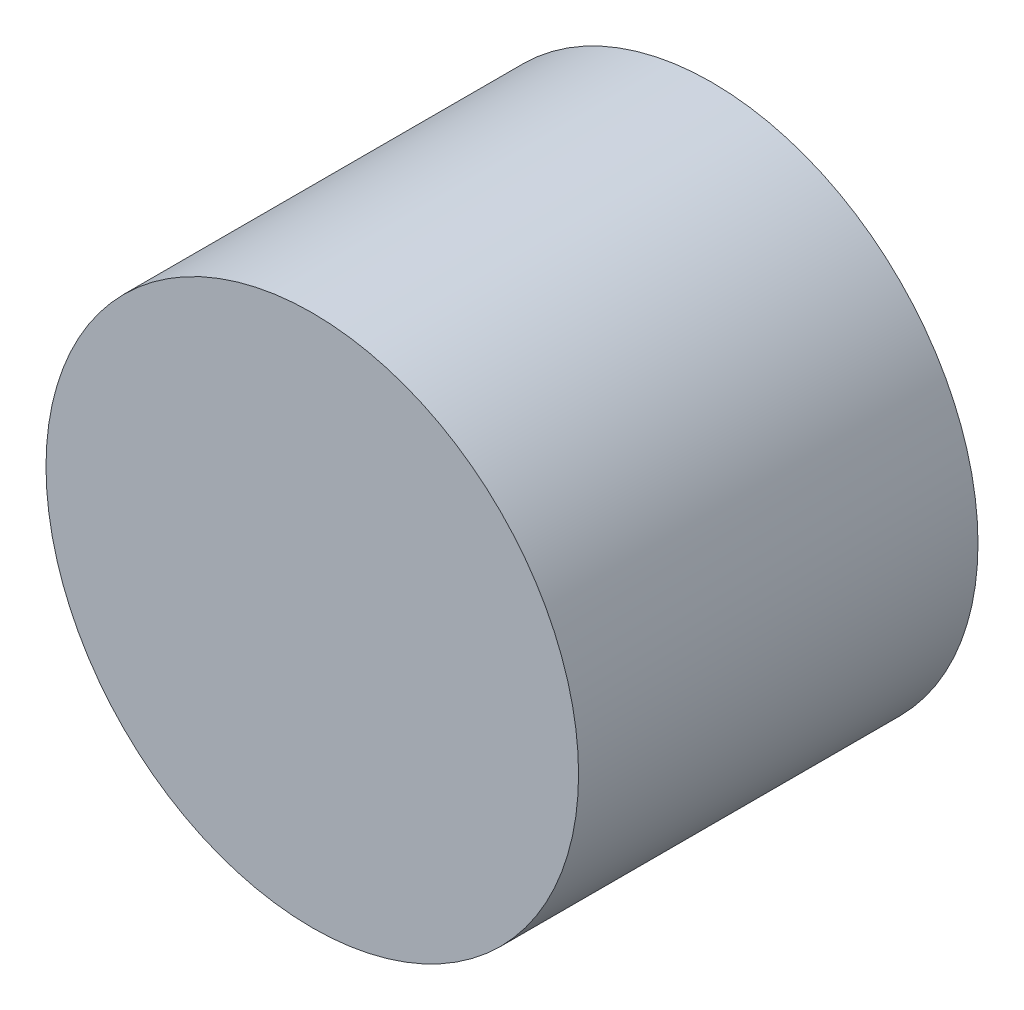
ISO-10303-21;
HEADER;
FILE_DESCRIPTION(('STEP AP214'),'2;1');
FILE_NAME('part.step','',(''),(''),'','','');
FILE_SCHEMA(('AUTOMOTIVE_DESIGN { 1 0 10303 214 1 1 1 1 }'));
ENDSEC;
DATA;
#1=APPLICATION_CONTEXT('core data for automotive mechanical design processes');
#2=APPLICATION_PROTOCOL_DEFINITION('international standard','automotive_design',2000,#1);
#3=PRODUCT_CONTEXT('',#1,'mechanical');
#4=PRODUCT('Part','Part','',(#3));
#5=PRODUCT_RELATED_PRODUCT_CATEGORY('part','',(#4));
#6=PRODUCT_DEFINITION_FORMATION('','',#4);
#7=PRODUCT_DEFINITION_CONTEXT('part definition',#1,'design');
#8=PRODUCT_DEFINITION('design','',#6,#7);
#9=PRODUCT_DEFINITION_SHAPE('','',#8);
#10=(LENGTH_UNIT() NAMED_UNIT(*) SI_UNIT(.MILLI.,.METRE.));
#11=(NAMED_UNIT(*) PLANE_ANGLE_UNIT() SI_UNIT($,.RADIAN.));
#12=(NAMED_UNIT(*) SI_UNIT($,.STERADIAN.) SOLID_ANGLE_UNIT());
#13=UNCERTAINTY_MEASURE_WITH_UNIT(LENGTH_MEASURE(1.E-05),#10,'distance_accuracy_value','');
#14=(GEOMETRIC_REPRESENTATION_CONTEXT(3) GLOBAL_UNCERTAINTY_ASSIGNED_CONTEXT((#13)) GLOBAL_UNIT_ASSIGNED_CONTEXT((#10,
#11,#12)) REPRESENTATION_CONTEXT('',''));
#15=CARTESIAN_POINT('',(0.,0.,0.));
#16=DIRECTION('',(0.,0.,1.));
#17=DIRECTION('',(1.,0.,0.));
#18=AXIS2_PLACEMENT_3D('',#15,#16,#17);
#19=CARTESIAN_POINT('',(0.,0.,8.59920009613037));
#20=DIRECTION('',(0.,0.,-1.));
#21=DIRECTION('',(-1.,0.,0.));
#22=AXIS2_PLACEMENT_3D('',#19,#20,#21);
#23=CYLINDRICAL_SURFACE('',#22,10.);
#24=CARTESIAN_POINT('',(0.,0.,8.59920009613037));
#25=DIRECTION('',(0.,0.,-1.));
#26=DIRECTION('',(-1.,0.,0.));
#27=AXIS2_PLACEMENT_3D('',#24,#25,#26);
#28=CIRCLE('',#27,10.);
#29=CARTESIAN_POINT('',(-10.,0.,8.59920009613037));
#30=VERTEX_POINT('',#29);
#31=EDGE_CURVE('E10',#30,#30,#28,.T.);
#32=ORIENTED_EDGE('',*,*,#31,.T.);
#33=EDGE_LOOP('',(#32));
#34=FACE_BOUND('',#33,.T.);
#35=CARTESIAN_POINT('',(0.,0.,-6.40079990386963));
#36=DIRECTION('',(0.,0.,-1.));
#37=DIRECTION('',(-1.,0.,0.));
#38=AXIS2_PLACEMENT_3D('',#35,#36,#37);
#39=CIRCLE('',#38,10.);
#40=CARTESIAN_POINT('',(-10.,0.,-6.40079990386963));
#41=VERTEX_POINT('',#40);
#42=EDGE_CURVE('E37',#41,#41,#39,.T.);
#43=ORIENTED_EDGE('',*,*,#42,.F.);
#44=EDGE_LOOP('',(#43));
#45=FACE_BOUND('',#44,.T.);
#46=ADVANCED_FACE('F33',(#34,#45),#23,.T.);
#47=CARTESIAN_POINT('',(0.,0.,8.59920009613037));
#48=DIRECTION('',(0.,0.,-1.));
#49=DIRECTION('',(-1.,0.,0.));
#50=AXIS2_PLACEMENT_3D('',#47,#48,#49);
#51=PLANE('',#50);
#52=ORIENTED_EDGE('',*,*,#31,.F.);
#53=EDGE_LOOP('',(#52));
#54=FACE_BOUND('',#53,.T.);
#55=ADVANCED_FACE('F48',(#54),#51,.F.);
#56=CARTESIAN_POINT('',(0.,0.,-6.40079990386963));
#57=DIRECTION('',(0.,0.,1.));
#58=DIRECTION('',(1.,0.,0.));
#59=AXIS2_PLACEMENT_3D('',#56,#57,#58);
#60=PLANE('',#59);
#61=ORIENTED_EDGE('',*,*,#42,.T.);
#62=EDGE_LOOP('',(#61));
#63=FACE_BOUND('',#62,.T.);
#64=ADVANCED_FACE('F35',(#63),#60,.F.);
#65=CLOSED_SHELL('',(#46,#55,#64));
#66=MANIFOLD_SOLID_BREP('B2',#65);
#67=ADVANCED_BREP_SHAPE_REPRESENTATION('',(#18,#66),#14);
#68=SHAPE_DEFINITION_REPRESENTATION(#9,#67);
ENDSEC;
END-ISO-10303-21;
